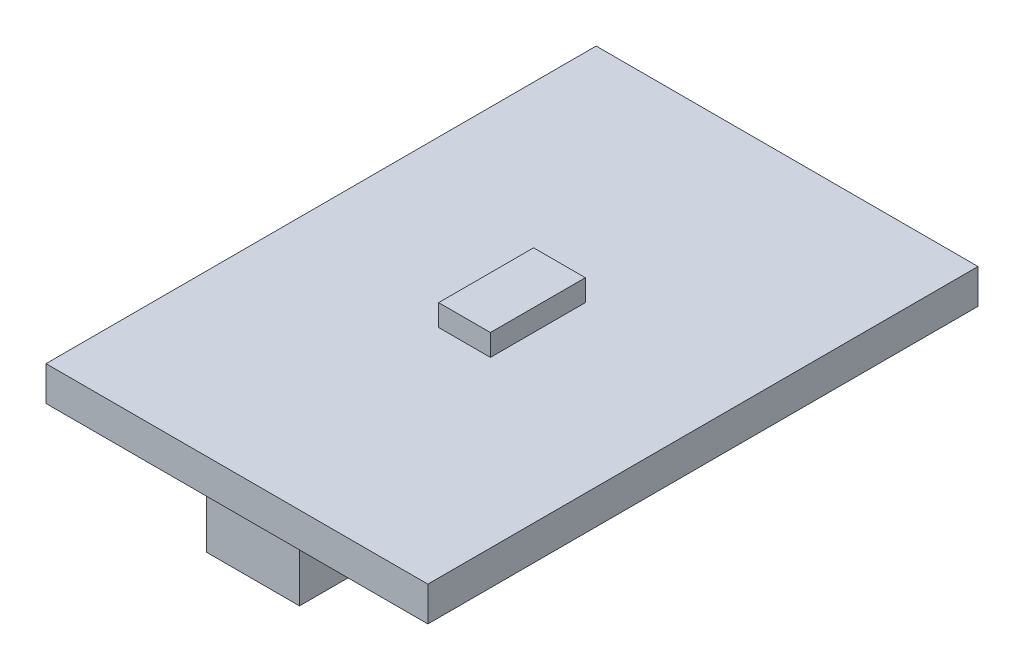
ISO-10303-21;
HEADER;
FILE_DESCRIPTION(('STEP AP214'),'2;1');
FILE_NAME('part.step','',(''),(''),'','','');
FILE_SCHEMA(('AUTOMOTIVE_DESIGN { 1 0 10303 214 1 1 1 1 }'));
ENDSEC;
DATA;
#1=APPLICATION_CONTEXT('core data for automotive mechanical design processes');
#2=APPLICATION_PROTOCOL_DEFINITION('international standard','automotive_design',2000,#1);
#3=PRODUCT_CONTEXT('',#1,'mechanical');
#4=PRODUCT('Part','Part','',(#3));
#5=PRODUCT_RELATED_PRODUCT_CATEGORY('part','',(#4));
#6=PRODUCT_DEFINITION_FORMATION('','',#4);
#7=PRODUCT_DEFINITION_CONTEXT('part definition',#1,'design');
#8=PRODUCT_DEFINITION('design','',#6,#7);
#9=PRODUCT_DEFINITION_SHAPE('','',#8);
#10=(LENGTH_UNIT() NAMED_UNIT(*) SI_UNIT(.MILLI.,.METRE.));
#11=(NAMED_UNIT(*) PLANE_ANGLE_UNIT() SI_UNIT($,.RADIAN.));
#12=(NAMED_UNIT(*) SI_UNIT($,.STERADIAN.) SOLID_ANGLE_UNIT());
#13=UNCERTAINTY_MEASURE_WITH_UNIT(LENGTH_MEASURE(1.E-05),#10,'distance_accuracy_value','');
#14=(GEOMETRIC_REPRESENTATION_CONTEXT(3) GLOBAL_UNCERTAINTY_ASSIGNED_CONTEXT((#13)) GLOBAL_UNIT_ASSIGNED_CONTEXT((#10,
#11,#12)) REPRESENTATION_CONTEXT('',''));
#15=CARTESIAN_POINT('',(0.,0.,0.));
#16=DIRECTION('',(0.,0.,1.));
#17=DIRECTION('',(1.,0.,0.));
#18=AXIS2_PLACEMENT_3D('',#15,#16,#17);
#19=CARTESIAN_POINT('',(-8.85,1.6,-12.75));
#20=DIRECTION('',(1.,0.,0.));
#21=DIRECTION('',(0.,0.,-1.));
#22=AXIS2_PLACEMENT_3D('',#19,#20,#21);
#23=PLANE('',#22);
#24=DIRECTION('',(0.,0.,1.));
#25=VECTOR('',#24,1.);
#26=CARTESIAN_POINT('',(-8.85,0.,-12.75));
#27=LINE('',#26,#25);
#28=CARTESIAN_POINT('',(-8.85,0.,-12.75));
#29=VERTEX_POINT('',#28);
#30=CARTESIAN_POINT('',(-8.85,0.,12.75));
#31=VERTEX_POINT('',#30);
#32=EDGE_CURVE('E252',#29,#31,#27,.T.);
#33=ORIENTED_EDGE('',*,*,#32,.T.);
#34=DIRECTION('',(0.,-1.,0.));
#35=VECTOR('',#34,1.);
#36=CARTESIAN_POINT('',(-8.85,1.6,12.75));
#37=LINE('',#36,#35);
#38=CARTESIAN_POINT('',(-8.85,1.6,12.75));
#39=VERTEX_POINT('',#38);
#40=EDGE_CURVE('E11',#39,#31,#37,.T.);
#41=ORIENTED_EDGE('',*,*,#40,.F.);
#42=DIRECTION('',(0.,0.,1.));
#43=VECTOR('',#42,1.);
#44=CARTESIAN_POINT('',(-8.85,1.6,-12.75));
#45=LINE('',#44,#43);
#46=CARTESIAN_POINT('',(-8.85,1.6,-12.75));
#47=VERTEX_POINT('',#46);
#48=EDGE_CURVE('E251',#47,#39,#45,.T.);
#49=ORIENTED_EDGE('',*,*,#48,.F.);
#50=DIRECTION('',(0.,-1.,0.));
#51=VECTOR('',#50,1.);
#52=CARTESIAN_POINT('',(-8.85,1.6,-12.75));
#53=LINE('',#52,#51);
#54=EDGE_CURVE('E263',#47,#29,#53,.T.);
#55=ORIENTED_EDGE('',*,*,#54,.T.);
#56=EDGE_LOOP('',(#33,#41,#49,#55));
#57=FACE_BOUND('',#56,.T.);
#58=ADVANCED_FACE('F39',(#57),#23,.F.);
#59=CARTESIAN_POINT('',(-8.85,1.6,12.75));
#60=DIRECTION('',(0.,0.,-1.));
#61=DIRECTION('',(-1.,0.,0.));
#62=AXIS2_PLACEMENT_3D('',#59,#60,#61);
#63=PLANE('',#62);
#64=DIRECTION('',(1.,0.,0.));
#65=VECTOR('',#64,1.);
#66=CARTESIAN_POINT('',(-8.85,0.,12.75));
#67=LINE('',#66,#65);
#68=CARTESIAN_POINT('',(8.85,0.,12.75));
#69=VERTEX_POINT('',#68);
#70=EDGE_CURVE('E266',#31,#69,#67,.T.);
#71=ORIENTED_EDGE('',*,*,#70,.T.);
#72=DIRECTION('',(0.,-1.,0.));
#73=VECTOR('',#72,1.);
#74=CARTESIAN_POINT('',(8.85,1.6,12.75));
#75=LINE('',#74,#73);
#76=CARTESIAN_POINT('',(8.85,1.6,12.75));
#77=VERTEX_POINT('',#76);
#78=EDGE_CURVE('E46',#77,#69,#75,.T.);
#79=ORIENTED_EDGE('',*,*,#78,.F.);
#80=DIRECTION('',(1.,0.,0.));
#81=VECTOR('',#80,1.);
#82=CARTESIAN_POINT('',(-8.85,1.6,12.75));
#83=LINE('',#82,#81);
#84=EDGE_CURVE('E258',#39,#77,#83,.T.);
#85=ORIENTED_EDGE('',*,*,#84,.F.);
#86=ORIENTED_EDGE('',*,*,#40,.T.);
#87=EDGE_LOOP('',(#71,#79,#85,#86));
#88=FACE_BOUND('',#87,.T.);
#89=ADVANCED_FACE('F298',(#88),#63,.F.);
#90=CARTESIAN_POINT('',(8.85,1.6,-12.75));
#91=DIRECTION('',(-1.,0.,0.));
#92=DIRECTION('',(0.,0.,1.));
#93=AXIS2_PLACEMENT_3D('',#90,#91,#92);
#94=PLANE('',#93);
#95=DIRECTION('',(0.,0.,-1.));
#96=VECTOR('',#95,1.);
#97=CARTESIAN_POINT('',(8.85,0.,-12.75));
#98=LINE('',#97,#96);
#99=CARTESIAN_POINT('',(8.85,0.,-12.75));
#100=VERTEX_POINT('',#99);
#101=EDGE_CURVE('E268',#69,#100,#98,.T.);
#102=ORIENTED_EDGE('',*,*,#101,.T.);
#103=DIRECTION('',(0.,-1.,0.));
#104=VECTOR('',#103,1.);
#105=CARTESIAN_POINT('',(8.85,1.6,-12.75));
#106=LINE('',#105,#104);
#107=CARTESIAN_POINT('',(8.85,1.6,-12.75));
#108=VERTEX_POINT('',#107);
#109=EDGE_CURVE('E272',#108,#100,#106,.T.);
#110=ORIENTED_EDGE('',*,*,#109,.F.);
#111=DIRECTION('',(0.,0.,-1.));
#112=VECTOR('',#111,1.);
#113=CARTESIAN_POINT('',(8.85,1.6,-12.75));
#114=LINE('',#113,#112);
#115=EDGE_CURVE('E259',#77,#108,#114,.T.);
#116=ORIENTED_EDGE('',*,*,#115,.F.);
#117=ORIENTED_EDGE('',*,*,#78,.T.);
#118=EDGE_LOOP('',(#102,#110,#116,#117));
#119=FACE_BOUND('',#118,.T.);
#120=ADVANCED_FACE('F278',(#119),#94,.F.);
#121=CARTESIAN_POINT('',(-8.85,1.6,-12.75));
#122=DIRECTION('',(0.,0.,1.));
#123=DIRECTION('',(1.,0.,0.));
#124=AXIS2_PLACEMENT_3D('',#121,#122,#123);
#125=PLANE('',#124);
#126=DIRECTION('',(-1.,0.,0.));
#127=VECTOR('',#126,1.);
#128=CARTESIAN_POINT('',(-8.85,0.,-12.75));
#129=LINE('',#128,#127);
#130=EDGE_CURVE('E260',#100,#29,#129,.T.);
#131=ORIENTED_EDGE('',*,*,#130,.T.);
#132=ORIENTED_EDGE('',*,*,#54,.F.);
#133=DIRECTION('',(-1.,0.,0.));
#134=VECTOR('',#133,1.);
#135=CARTESIAN_POINT('',(-8.85,1.6,-12.75));
#136=LINE('',#135,#134);
#137=EDGE_CURVE('E261',#108,#47,#136,.T.);
#138=ORIENTED_EDGE('',*,*,#137,.F.);
#139=ORIENTED_EDGE('',*,*,#109,.T.);
#140=EDGE_LOOP('',(#131,#132,#138,#139));
#141=FACE_BOUND('',#140,.T.);
#142=ADVANCED_FACE('F289',(#141),#125,.F.);
#143=CARTESIAN_POINT('',(0.,1.6,0.));
#144=DIRECTION('',(0.,1.,0.));
#145=DIRECTION('',(0.,0.,1.));
#146=AXIS2_PLACEMENT_3D('',#143,#144,#145);
#147=PLANE('',#146);
#148=DIRECTION('',(0.,0.,1.));
#149=VECTOR('',#148,1.);
#150=CARTESIAN_POINT('',(-1.2,1.6,-2.2));
#151=LINE('',#150,#149);
#152=CARTESIAN_POINT('',(-1.2,1.6,-2.2));
#153=VERTEX_POINT('',#152);
#154=CARTESIAN_POINT('',(-1.2,1.6,2.2));
#155=VERTEX_POINT('',#154);
#156=EDGE_CURVE('E188',#153,#155,#151,.T.);
#157=ORIENTED_EDGE('',*,*,#156,.F.);
#158=DIRECTION('',(-1.,0.,0.));
#159=VECTOR('',#158,1.);
#160=CARTESIAN_POINT('',(-1.2,1.6,-2.2));
#161=LINE('',#160,#159);
#162=CARTESIAN_POINT('',(1.2,1.6,-2.2));
#163=VERTEX_POINT('',#162);
#164=EDGE_CURVE('E221',#163,#153,#161,.T.);
#165=ORIENTED_EDGE('',*,*,#164,.F.);
#166=DIRECTION('',(0.,0.,-1.));
#167=VECTOR('',#166,1.);
#168=CARTESIAN_POINT('',(1.2,1.6,-2.2));
#169=LINE('',#168,#167);
#170=CARTESIAN_POINT('',(1.2,1.6,2.2));
#171=VERTEX_POINT('',#170);
#172=EDGE_CURVE('E237',#171,#163,#169,.T.);
#173=ORIENTED_EDGE('',*,*,#172,.F.);
#174=DIRECTION('',(1.,0.,0.));
#175=VECTOR('',#174,1.);
#176=CARTESIAN_POINT('',(-1.2,1.6,2.2));
#177=LINE('',#176,#175);
#178=EDGE_CURVE('E233',#155,#171,#177,.T.);
#179=ORIENTED_EDGE('',*,*,#178,.F.);
#180=EDGE_LOOP('',(#157,#165,#173,#179));
#181=FACE_BOUND('',#180,.T.);
#182=ORIENTED_EDGE('',*,*,#48,.T.);
#183=ORIENTED_EDGE('',*,*,#84,.T.);
#184=ORIENTED_EDGE('',*,*,#115,.T.);
#185=ORIENTED_EDGE('',*,*,#137,.T.);
#186=EDGE_LOOP('',(#182,#183,#184,#185));
#187=FACE_BOUND('',#186,.T.);
#188=ADVANCED_FACE('F293',(#181,#187),#147,.T.);
#189=CARTESIAN_POINT('',(0.,0.,0.));
#190=DIRECTION('',(0.,1.,0.));
#191=DIRECTION('',(0.,0.,1.));
#192=AXIS2_PLACEMENT_3D('',#189,#190,#191);
#193=PLANE('',#192);
#194=DIRECTION('',(-1.,0.,0.));
#195=VECTOR('',#194,1.);
#196=CARTESIAN_POINT('',(-2.15,0.,6.));
#197=LINE('',#196,#195);
#198=CARTESIAN_POINT('',(2.15,0.,6.));
#199=VERTEX_POINT('',#198);
#200=CARTESIAN_POINT('',(-2.15,0.,6.));
#201=VERTEX_POINT('',#200);
#202=EDGE_CURVE('E171',#199,#201,#197,.T.);
#203=ORIENTED_EDGE('',*,*,#202,.T.);
#204=DIRECTION('',(0.,0.,1.));
#205=VECTOR('',#204,1.);
#206=CARTESIAN_POINT('',(-2.15,0.,6.));
#207=LINE('',#206,#205);
#208=CARTESIAN_POINT('',(-2.15,0.,12.));
#209=VERTEX_POINT('',#208);
#210=EDGE_CURVE('E52',#201,#209,#207,.T.);
#211=ORIENTED_EDGE('',*,*,#210,.T.);
#212=DIRECTION('',(1.,0.,0.));
#213=VECTOR('',#212,1.);
#214=CARTESIAN_POINT('',(-2.15,0.,12.));
#215=LINE('',#214,#213);
#216=CARTESIAN_POINT('',(2.15,0.,12.));
#217=VERTEX_POINT('',#216);
#218=EDGE_CURVE('E156',#209,#217,#215,.T.);
#219=ORIENTED_EDGE('',*,*,#218,.T.);
#220=DIRECTION('',(0.,0.,-1.));
#221=VECTOR('',#220,1.);
#222=CARTESIAN_POINT('',(2.15,0.,6.));
#223=LINE('',#222,#221);
#224=EDGE_CURVE('E177',#217,#199,#223,.T.);
#225=ORIENTED_EDGE('',*,*,#224,.T.);
#226=EDGE_LOOP('',(#203,#211,#219,#225));
#227=FACE_BOUND('',#226,.T.);
#228=DIRECTION('',(-1.,0.,0.));
#229=VECTOR('',#228,1.);
#230=CARTESIAN_POINT('',(-2.15,0.,-12.));
#231=LINE('',#230,#229);
#232=CARTESIAN_POINT('',(2.15,0.,-12.));
#233=VERTEX_POINT('',#232);
#234=CARTESIAN_POINT('',(-2.15,0.,-12.));
#235=VERTEX_POINT('',#234);
#236=EDGE_CURVE('E200',#233,#235,#231,.T.);
#237=ORIENTED_EDGE('',*,*,#236,.T.);
#238=DIRECTION('',(0.,0.,1.));
#239=VECTOR('',#238,1.);
#240=CARTESIAN_POINT('',(-2.15,0.,-12.));
#241=LINE('',#240,#239);
#242=CARTESIAN_POINT('',(-2.15,0.,-6.));
#243=VERTEX_POINT('',#242);
#244=EDGE_CURVE('E63',#235,#243,#241,.T.);
#245=ORIENTED_EDGE('',*,*,#244,.T.);
#246=DIRECTION('',(1.,0.,0.));
#247=VECTOR('',#246,1.);
#248=CARTESIAN_POINT('',(-2.15,0.,-6.));
#249=LINE('',#248,#247);
#250=CARTESIAN_POINT('',(2.15,0.,-6.));
#251=VERTEX_POINT('',#250);
#252=EDGE_CURVE('E206',#243,#251,#249,.T.);
#253=ORIENTED_EDGE('',*,*,#252,.T.);
#254=DIRECTION('',(0.,0.,-1.));
#255=VECTOR('',#254,1.);
#256=CARTESIAN_POINT('',(2.15,0.,-12.));
#257=LINE('',#256,#255);
#258=EDGE_CURVE('E205',#251,#233,#257,.T.);
#259=ORIENTED_EDGE('',*,*,#258,.T.);
#260=EDGE_LOOP('',(#237,#245,#253,#259));
#261=FACE_BOUND('',#260,.T.);
#262=ORIENTED_EDGE('',*,*,#32,.F.);
#263=ORIENTED_EDGE('',*,*,#130,.F.);
#264=ORIENTED_EDGE('',*,*,#101,.F.);
#265=ORIENTED_EDGE('',*,*,#70,.F.);
#266=EDGE_LOOP('',(#262,#263,#264,#265));
#267=FACE_BOUND('',#266,.T.);
#268=ADVANCED_FACE('F287',(#227,#261,#267),#193,.F.);
#269=CARTESIAN_POINT('',(-1.2,2.6,-2.2));
#270=DIRECTION('',(1.,0.,0.));
#271=DIRECTION('',(0.,0.,-1.));
#272=AXIS2_PLACEMENT_3D('',#269,#270,#271);
#273=PLANE('',#272);
#274=ORIENTED_EDGE('',*,*,#156,.T.);
#275=DIRECTION('',(0.,-1.,0.));
#276=VECTOR('',#275,1.);
#277=CARTESIAN_POINT('',(-1.2,2.6,2.2));
#278=LINE('',#277,#276);
#279=CARTESIAN_POINT('',(-1.2,2.6,2.2));
#280=VERTEX_POINT('',#279);
#281=EDGE_CURVE('E249',#280,#155,#278,.T.);
#282=ORIENTED_EDGE('',*,*,#281,.F.);
#283=DIRECTION('',(0.,0.,1.));
#284=VECTOR('',#283,1.);
#285=CARTESIAN_POINT('',(-1.2,2.6,-2.2));
#286=LINE('',#285,#284);
#287=CARTESIAN_POINT('',(-1.2,2.6,-2.2));
#288=VERTEX_POINT('',#287);
#289=EDGE_CURVE('E219',#288,#280,#286,.T.);
#290=ORIENTED_EDGE('',*,*,#289,.F.);
#291=DIRECTION('',(0.,-1.,0.));
#292=VECTOR('',#291,1.);
#293=CARTESIAN_POINT('',(-1.2,2.6,-2.2));
#294=LINE('',#293,#292);
#295=EDGE_CURVE('E229',#288,#153,#294,.T.);
#296=ORIENTED_EDGE('',*,*,#295,.T.);
#297=EDGE_LOOP('',(#274,#282,#290,#296));
#298=FACE_BOUND('',#297,.T.);
#299=ADVANCED_FACE('F306',(#298),#273,.F.);
#300=CARTESIAN_POINT('',(-1.2,2.6,2.2));
#301=DIRECTION('',(0.,0.,-1.));
#302=DIRECTION('',(-1.,0.,0.));
#303=AXIS2_PLACEMENT_3D('',#300,#301,#302);
#304=PLANE('',#303);
#305=ORIENTED_EDGE('',*,*,#178,.T.);
#306=DIRECTION('',(0.,-1.,0.));
#307=VECTOR('',#306,1.);
#308=CARTESIAN_POINT('',(1.2,2.6,2.2));
#309=LINE('',#308,#307);
#310=CARTESIAN_POINT('',(1.2,2.6,2.2));
#311=VERTEX_POINT('',#310);
#312=EDGE_CURVE('E247',#311,#171,#309,.T.);
#313=ORIENTED_EDGE('',*,*,#312,.F.);
#314=DIRECTION('',(1.,0.,0.));
#315=VECTOR('',#314,1.);
#316=CARTESIAN_POINT('',(-1.2,2.6,2.2));
#317=LINE('',#316,#315);
#318=EDGE_CURVE('E224',#280,#311,#317,.T.);
#319=ORIENTED_EDGE('',*,*,#318,.F.);
#320=ORIENTED_EDGE('',*,*,#281,.T.);
#321=EDGE_LOOP('',(#305,#313,#319,#320));
#322=FACE_BOUND('',#321,.T.);
#323=ADVANCED_FACE('F312',(#322),#304,.F.);
#324=CARTESIAN_POINT('',(1.2,2.6,-2.2));
#325=DIRECTION('',(-1.,0.,0.));
#326=DIRECTION('',(0.,0.,1.));
#327=AXIS2_PLACEMENT_3D('',#324,#325,#326);
#328=PLANE('',#327);
#329=ORIENTED_EDGE('',*,*,#172,.T.);
#330=DIRECTION('',(0.,-1.,0.));
#331=VECTOR('',#330,1.);
#332=CARTESIAN_POINT('',(1.2,2.6,-2.2));
#333=LINE('',#332,#331);
#334=CARTESIAN_POINT('',(1.2,2.6,-2.2));
#335=VERTEX_POINT('',#334);
#336=EDGE_CURVE('E241',#335,#163,#333,.T.);
#337=ORIENTED_EDGE('',*,*,#336,.F.);
#338=DIRECTION('',(0.,0.,-1.));
#339=VECTOR('',#338,1.);
#340=CARTESIAN_POINT('',(1.2,2.6,-2.2));
#341=LINE('',#340,#339);
#342=EDGE_CURVE('E228',#311,#335,#341,.T.);
#343=ORIENTED_EDGE('',*,*,#342,.F.);
#344=ORIENTED_EDGE('',*,*,#312,.T.);
#345=EDGE_LOOP('',(#329,#337,#343,#344));
#346=FACE_BOUND('',#345,.T.);
#347=ADVANCED_FACE('F317',(#346),#328,.F.);
#348=CARTESIAN_POINT('',(-1.2,2.6,-2.2));
#349=DIRECTION('',(0.,0.,1.));
#350=DIRECTION('',(1.,0.,0.));
#351=AXIS2_PLACEMENT_3D('',#348,#349,#350);
#352=PLANE('',#351);
#353=ORIENTED_EDGE('',*,*,#164,.T.);
#354=ORIENTED_EDGE('',*,*,#295,.F.);
#355=DIRECTION('',(-1.,0.,0.));
#356=VECTOR('',#355,1.);
#357=CARTESIAN_POINT('',(-1.2,2.6,-2.2));
#358=LINE('',#357,#356);
#359=EDGE_CURVE('E226',#335,#288,#358,.T.);
#360=ORIENTED_EDGE('',*,*,#359,.F.);
#361=ORIENTED_EDGE('',*,*,#336,.T.);
#362=EDGE_LOOP('',(#353,#354,#360,#361));
#363=FACE_BOUND('',#362,.T.);
#364=ADVANCED_FACE('F323',(#363),#352,.F.);
#365=CARTESIAN_POINT('',(0.,2.6,0.));
#366=DIRECTION('',(0.,1.,0.));
#367=DIRECTION('',(0.,0.,1.));
#368=AXIS2_PLACEMENT_3D('',#365,#366,#367);
#369=PLANE('',#368);
#370=ORIENTED_EDGE('',*,*,#289,.T.);
#371=ORIENTED_EDGE('',*,*,#318,.T.);
#372=ORIENTED_EDGE('',*,*,#342,.T.);
#373=ORIENTED_EDGE('',*,*,#359,.T.);
#374=EDGE_LOOP('',(#370,#371,#372,#373));
#375=FACE_BOUND('',#374,.T.);
#376=ADVANCED_FACE('F330',(#375),#369,.T.);
#377=CARTESIAN_POINT('',(-2.15,-3.,-12.));
#378=DIRECTION('',(-1.,0.,0.));
#379=DIRECTION('',(0.,0.,1.));
#380=AXIS2_PLACEMENT_3D('',#377,#378,#379);
#381=PLANE('',#380);
#382=ORIENTED_EDGE('',*,*,#244,.F.);
#383=DIRECTION('',(0.,1.,0.));
#384=VECTOR('',#383,1.);
#385=CARTESIAN_POINT('',(-2.15,-3.,-12.));
#386=LINE('',#385,#384);
#387=CARTESIAN_POINT('',(-2.15,-3.,-12.));
#388=VERTEX_POINT('',#387);
#389=EDGE_CURVE('E197',#388,#235,#386,.T.);
#390=ORIENTED_EDGE('',*,*,#389,.F.);
#391=DIRECTION('',(0.,0.,1.));
#392=VECTOR('',#391,1.);
#393=CARTESIAN_POINT('',(-2.15,-3.,-12.));
#394=LINE('',#393,#392);
#395=CARTESIAN_POINT('',(-2.15,-3.,-6.));
#396=VERTEX_POINT('',#395);
#397=EDGE_CURVE('E201',#388,#396,#394,.T.);
#398=ORIENTED_EDGE('',*,*,#397,.T.);
#399=DIRECTION('',(0.,1.,0.));
#400=VECTOR('',#399,1.);
#401=CARTESIAN_POINT('',(-2.15,-3.,-6.));
#402=LINE('',#401,#400);
#403=EDGE_CURVE('E189',#396,#243,#402,.T.);
#404=ORIENTED_EDGE('',*,*,#403,.T.);
#405=EDGE_LOOP('',(#382,#390,#398,#404));
#406=FACE_BOUND('',#405,.T.);
#407=ADVANCED_FACE('F332',(#406),#381,.T.);
#408=CARTESIAN_POINT('',(-2.15,-3.,-12.));
#409=DIRECTION('',(0.,0.,-1.));
#410=DIRECTION('',(-1.,0.,0.));
#411=AXIS2_PLACEMENT_3D('',#408,#409,#410);
#412=PLANE('',#411);
#413=ORIENTED_EDGE('',*,*,#236,.F.);
#414=DIRECTION('',(0.,1.,0.));
#415=VECTOR('',#414,1.);
#416=CARTESIAN_POINT('',(2.15,-3.,-12.));
#417=LINE('',#416,#415);
#418=CARTESIAN_POINT('',(2.15,-3.,-12.));
#419=VERTEX_POINT('',#418);
#420=EDGE_CURVE('E191',#419,#233,#417,.T.);
#421=ORIENTED_EDGE('',*,*,#420,.F.);
#422=DIRECTION('',(-1.,0.,0.));
#423=VECTOR('',#422,1.);
#424=CARTESIAN_POINT('',(-2.15,-3.,-12.));
#425=LINE('',#424,#423);
#426=EDGE_CURVE('E195',#419,#388,#425,.T.);
#427=ORIENTED_EDGE('',*,*,#426,.T.);
#428=ORIENTED_EDGE('',*,*,#389,.T.);
#429=EDGE_LOOP('',(#413,#421,#427,#428));
#430=FACE_BOUND('',#429,.T.);
#431=ADVANCED_FACE('F336',(#430),#412,.T.);
#432=CARTESIAN_POINT('',(2.15,-3.,-12.));
#433=DIRECTION('',(1.,0.,0.));
#434=DIRECTION('',(0.,0.,-1.));
#435=AXIS2_PLACEMENT_3D('',#432,#433,#434);
#436=PLANE('',#435);
#437=ORIENTED_EDGE('',*,*,#258,.F.);
#438=DIRECTION('',(0.,1.,0.));
#439=VECTOR('',#438,1.);
#440=CARTESIAN_POINT('',(2.15,-3.,-6.));
#441=LINE('',#440,#439);
#442=CARTESIAN_POINT('',(2.15,-3.,-6.));
#443=VERTEX_POINT('',#442);
#444=EDGE_CURVE('E193',#443,#251,#441,.T.);
#445=ORIENTED_EDGE('',*,*,#444,.F.);
#446=DIRECTION('',(0.,0.,-1.));
#447=VECTOR('',#446,1.);
#448=CARTESIAN_POINT('',(2.15,-3.,-12.));
#449=LINE('',#448,#447);
#450=EDGE_CURVE('E215',#443,#419,#449,.T.);
#451=ORIENTED_EDGE('',*,*,#450,.T.);
#452=ORIENTED_EDGE('',*,*,#420,.T.);
#453=EDGE_LOOP('',(#437,#445,#451,#452));
#454=FACE_BOUND('',#453,.T.);
#455=ADVANCED_FACE('F342',(#454),#436,.T.);
#456=CARTESIAN_POINT('',(-2.15,-3.,-6.));
#457=DIRECTION('',(0.,0.,1.));
#458=DIRECTION('',(1.,0.,0.));
#459=AXIS2_PLACEMENT_3D('',#456,#457,#458);
#460=PLANE('',#459);
#461=ORIENTED_EDGE('',*,*,#252,.F.);
#462=ORIENTED_EDGE('',*,*,#403,.F.);
#463=DIRECTION('',(1.,0.,0.));
#464=VECTOR('',#463,1.);
#465=CARTESIAN_POINT('',(-2.15,-3.,-6.));
#466=LINE('',#465,#464);
#467=EDGE_CURVE('E214',#396,#443,#466,.T.);
#468=ORIENTED_EDGE('',*,*,#467,.T.);
#469=ORIENTED_EDGE('',*,*,#444,.T.);
#470=EDGE_LOOP('',(#461,#462,#468,#469));
#471=FACE_BOUND('',#470,.T.);
#472=ADVANCED_FACE('F338',(#471),#460,.T.);
#473=CARTESIAN_POINT('',(0.,-3.,0.));
#474=DIRECTION('',(0.,1.,0.));
#475=DIRECTION('',(0.,0.,1.));
#476=AXIS2_PLACEMENT_3D('',#473,#474,#475);
#477=PLANE('',#476);
#478=ORIENTED_EDGE('',*,*,#397,.F.);
#479=ORIENTED_EDGE('',*,*,#426,.F.);
#480=ORIENTED_EDGE('',*,*,#450,.F.);
#481=ORIENTED_EDGE('',*,*,#467,.F.);
#482=EDGE_LOOP('',(#478,#479,#480,#481));
#483=FACE_BOUND('',#482,.T.);
#484=ADVANCED_FACE('F334',(#483),#477,.F.);
#485=CARTESIAN_POINT('',(-2.15,-3.,6.));
#486=DIRECTION('',(-1.,0.,0.));
#487=DIRECTION('',(0.,0.,1.));
#488=AXIS2_PLACEMENT_3D('',#485,#486,#487);
#489=PLANE('',#488);
#490=ORIENTED_EDGE('',*,*,#210,.F.);
#491=DIRECTION('',(0.,1.,0.));
#492=VECTOR('',#491,1.);
#493=CARTESIAN_POINT('',(-2.15,-3.,6.));
#494=LINE('',#493,#492);
#495=CARTESIAN_POINT('',(-2.15,-3.,6.));
#496=VERTEX_POINT('',#495);
#497=EDGE_CURVE('E175',#496,#201,#494,.T.);
#498=ORIENTED_EDGE('',*,*,#497,.F.);
#499=DIRECTION('',(0.,0.,1.));
#500=VECTOR('',#499,1.);
#501=CARTESIAN_POINT('',(-2.15,-3.,6.));
#502=LINE('',#501,#500);
#503=CARTESIAN_POINT('',(-2.15,-3.,12.));
#504=VERTEX_POINT('',#503);
#505=EDGE_CURVE('E167',#496,#504,#502,.T.);
#506=ORIENTED_EDGE('',*,*,#505,.T.);
#507=DIRECTION('',(0.,1.,0.));
#508=VECTOR('',#507,1.);
#509=CARTESIAN_POINT('',(-2.15,-3.,12.));
#510=LINE('',#509,#508);
#511=EDGE_CURVE('E151',#504,#209,#510,.T.);
#512=ORIENTED_EDGE('',*,*,#511,.T.);
#513=EDGE_LOOP('',(#490,#498,#506,#512));
#514=FACE_BOUND('',#513,.T.);
#515=ADVANCED_FACE('F173',(#514),#489,.T.);
#516=CARTESIAN_POINT('',(-2.15,-3.,6.));
#517=DIRECTION('',(0.,0.,-1.));
#518=DIRECTION('',(-1.,0.,0.));
#519=AXIS2_PLACEMENT_3D('',#516,#517,#518);
#520=PLANE('',#519);
#521=ORIENTED_EDGE('',*,*,#202,.F.);
#522=DIRECTION('',(0.,1.,0.));
#523=VECTOR('',#522,1.);
#524=CARTESIAN_POINT('',(2.15,-3.,6.));
#525=LINE('',#524,#523);
#526=CARTESIAN_POINT('',(2.15,-3.,6.));
#527=VERTEX_POINT('',#526);
#528=EDGE_CURVE('E190',#527,#199,#525,.T.);
#529=ORIENTED_EDGE('',*,*,#528,.F.);
#530=DIRECTION('',(-1.,0.,0.));
#531=VECTOR('',#530,1.);
#532=CARTESIAN_POINT('',(-2.15,-3.,6.));
#533=LINE('',#532,#531);
#534=EDGE_CURVE('E157',#527,#496,#533,.T.);
#535=ORIENTED_EDGE('',*,*,#534,.T.);
#536=ORIENTED_EDGE('',*,*,#497,.T.);
#537=EDGE_LOOP('',(#521,#529,#535,#536));
#538=FACE_BOUND('',#537,.T.);
#539=ADVANCED_FACE('F351',(#538),#520,.T.);
#540=CARTESIAN_POINT('',(2.15,-3.,6.));
#541=DIRECTION('',(1.,0.,0.));
#542=DIRECTION('',(0.,0.,-1.));
#543=AXIS2_PLACEMENT_3D('',#540,#541,#542);
#544=PLANE('',#543);
#545=ORIENTED_EDGE('',*,*,#224,.F.);
#546=DIRECTION('',(0.,1.,0.));
#547=VECTOR('',#546,1.);
#548=CARTESIAN_POINT('',(2.15,-3.,12.));
#549=LINE('',#548,#547);
#550=CARTESIAN_POINT('',(2.15,-3.,12.));
#551=VERTEX_POINT('',#550);
#552=EDGE_CURVE('E158',#551,#217,#549,.T.);
#553=ORIENTED_EDGE('',*,*,#552,.F.);
#554=DIRECTION('',(0.,0.,-1.));
#555=VECTOR('',#554,1.);
#556=CARTESIAN_POINT('',(2.15,-3.,6.));
#557=LINE('',#556,#555);
#558=EDGE_CURVE('E166',#551,#527,#557,.T.);
#559=ORIENTED_EDGE('',*,*,#558,.T.);
#560=ORIENTED_EDGE('',*,*,#528,.T.);
#561=EDGE_LOOP('',(#545,#553,#559,#560));
#562=FACE_BOUND('',#561,.T.);
#563=ADVANCED_FACE('F357',(#562),#544,.T.);
#564=CARTESIAN_POINT('',(-2.15,-3.,12.));
#565=DIRECTION('',(0.,0.,1.));
#566=DIRECTION('',(1.,0.,0.));
#567=AXIS2_PLACEMENT_3D('',#564,#565,#566);
#568=PLANE('',#567);
#569=ORIENTED_EDGE('',*,*,#218,.F.);
#570=ORIENTED_EDGE('',*,*,#511,.F.);
#571=DIRECTION('',(1.,0.,0.));
#572=VECTOR('',#571,1.);
#573=CARTESIAN_POINT('',(-2.15,-3.,12.));
#574=LINE('',#573,#572);
#575=EDGE_CURVE('E152',#504,#551,#574,.T.);
#576=ORIENTED_EDGE('',*,*,#575,.T.);
#577=ORIENTED_EDGE('',*,*,#552,.T.);
#578=EDGE_LOOP('',(#569,#570,#576,#577));
#579=FACE_BOUND('',#578,.T.);
#580=ADVANCED_FACE('F153',(#579),#568,.T.);
#581=CARTESIAN_POINT('',(0.,-3.,0.));
#582=DIRECTION('',(0.,1.,0.));
#583=DIRECTION('',(0.,0.,1.));
#584=AXIS2_PLACEMENT_3D('',#581,#582,#583);
#585=PLANE('',#584);
#586=ORIENTED_EDGE('',*,*,#505,.F.);
#587=ORIENTED_EDGE('',*,*,#534,.F.);
#588=ORIENTED_EDGE('',*,*,#558,.F.);
#589=ORIENTED_EDGE('',*,*,#575,.F.);
#590=EDGE_LOOP('',(#586,#587,#588,#589));
#591=FACE_BOUND('',#590,.T.);
#592=ADVANCED_FACE('F163',(#591),#585,.F.);
#593=CLOSED_SHELL('',(#58,#89,#120,#142,#188,#268,#299,#323,#347,#364,#376,#407,#431,#455,#472,
#484,#515,#539,#563,#580,#592));
#594=MANIFOLD_SOLID_BREP('B2',#593);
#595=ADVANCED_BREP_SHAPE_REPRESENTATION('',(#18,#594),#14);
#596=SHAPE_DEFINITION_REPRESENTATION(#9,#595);
ENDSEC;
END-ISO-10303-21;
